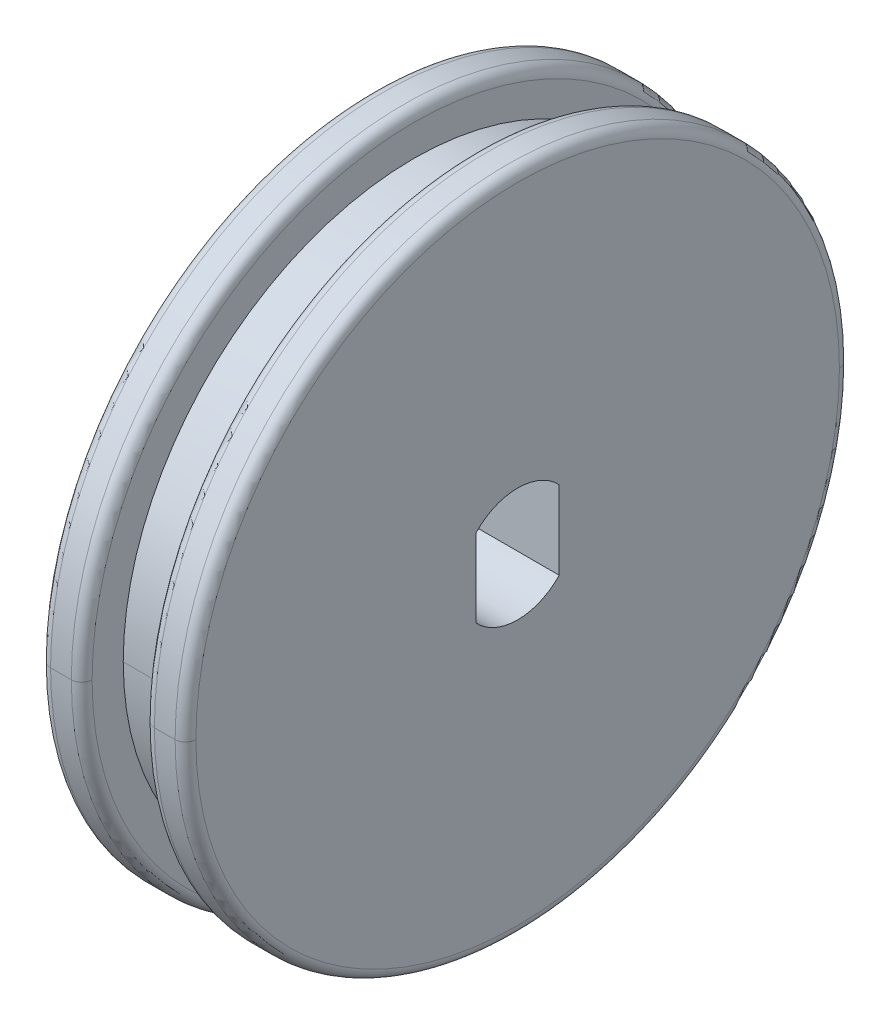
ISO-10303-21;
HEADER;
FILE_DESCRIPTION(('STEP AP214'),'2;1');
FILE_NAME('part.step','',(''),(''),'','','');
FILE_SCHEMA(('AUTOMOTIVE_DESIGN { 1 0 10303 214 1 1 1 1 }'));
ENDSEC;
DATA;
#1=APPLICATION_CONTEXT('core data for automotive mechanical design processes');
#2=APPLICATION_PROTOCOL_DEFINITION('international standard','automotive_design',2000,#1);
#3=PRODUCT_CONTEXT('',#1,'mechanical');
#4=PRODUCT('Part','Part','',(#3));
#5=PRODUCT_RELATED_PRODUCT_CATEGORY('part','',(#4));
#6=PRODUCT_DEFINITION_FORMATION('','',#4);
#7=PRODUCT_DEFINITION_CONTEXT('part definition',#1,'design');
#8=PRODUCT_DEFINITION('design','',#6,#7);
#9=PRODUCT_DEFINITION_SHAPE('','',#8);
#10=(LENGTH_UNIT() NAMED_UNIT(*) SI_UNIT(.MILLI.,.METRE.));
#11=(NAMED_UNIT(*) PLANE_ANGLE_UNIT() SI_UNIT($,.RADIAN.));
#12=(NAMED_UNIT(*) SI_UNIT($,.STERADIAN.) SOLID_ANGLE_UNIT());
#13=UNCERTAINTY_MEASURE_WITH_UNIT(LENGTH_MEASURE(1.E-05),#10,'distance_accuracy_value','');
#14=(GEOMETRIC_REPRESENTATION_CONTEXT(3) GLOBAL_UNCERTAINTY_ASSIGNED_CONTEXT((#13)) GLOBAL_UNIT_ASSIGNED_CONTEXT((#10,
#11,#12)) REPRESENTATION_CONTEXT('',''));
#15=CARTESIAN_POINT('',(0.,0.,0.));
#16=DIRECTION('',(0.,0.,1.));
#17=DIRECTION('',(1.,0.,0.));
#18=AXIS2_PLACEMENT_3D('',#15,#16,#17);
#19=CARTESIAN_POINT('',(6.5,0.,0.));
#20=DIRECTION('',(-1.,0.,0.));
#21=DIRECTION('',(0.,0.,1.));
#22=AXIS2_PLACEMENT_3D('',#19,#20,#21);
#23=CYLINDRICAL_SURFACE('',#22,2.75);
#24=DIRECTION('',(-1.,0.,0.));
#25=VECTOR('',#24,1.);
#26=CARTESIAN_POINT('',(6.5,1.88745860881769,2.));
#27=LINE('',#26,#25);
#28=CARTESIAN_POINT('',(3.5,1.88745860881769,2.));
#29=VERTEX_POINT('',#28);
#30=CARTESIAN_POINT('',(-3.5,1.88745860881769,2.));
#31=VERTEX_POINT('',#30);
#32=EDGE_CURVE('E243',#29,#31,#27,.T.);
#33=ORIENTED_EDGE('',*,*,#32,.T.);
#34=CARTESIAN_POINT('',(-3.5,0.,0.));
#35=DIRECTION('',(-1.,0.,0.));
#36=DIRECTION('',(0.,0.,1.));
#37=AXIS2_PLACEMENT_3D('',#34,#35,#36);
#38=CIRCLE('',#37,2.75);
#39=CARTESIAN_POINT('',(-3.5,1.88745860881769,-2.));
#40=VERTEX_POINT('',#39);
#41=EDGE_CURVE('E280',#31,#40,#38,.T.);
#42=ORIENTED_EDGE('',*,*,#41,.T.);
#43=DIRECTION('',(-1.,0.,0.));
#44=VECTOR('',#43,1.);
#45=CARTESIAN_POINT('',(6.5,1.88745860881769,-2.));
#46=LINE('',#45,#44);
#47=CARTESIAN_POINT('',(3.5,1.88745860881769,-2.));
#48=VERTEX_POINT('',#47);
#49=EDGE_CURVE('E10',#48,#40,#46,.T.);
#50=ORIENTED_EDGE('',*,*,#49,.F.);
#51=CARTESIAN_POINT('',(3.5,0.,0.));
#52=DIRECTION('',(-1.,0.,0.));
#53=DIRECTION('',(0.,0.,1.));
#54=AXIS2_PLACEMENT_3D('',#51,#52,#53);
#55=CIRCLE('',#54,2.75);
#56=EDGE_CURVE('E226',#29,#48,#55,.T.);
#57=ORIENTED_EDGE('',*,*,#56,.F.);
#58=EDGE_LOOP('',(#33,#42,#50,#57));
#59=FACE_BOUND('',#58,.T.);
#60=ADVANCED_FACE('F16',(#59),#23,.F.);
#61=CARTESIAN_POINT('',(6.5,0.,-2.));
#62=DIRECTION('',(0.,0.,1.));
#63=DIRECTION('',(0.,-1.,0.));
#64=AXIS2_PLACEMENT_3D('',#61,#62,#63);
#65=PLANE('',#64);
#66=DIRECTION('',(0.,1.,0.));
#67=VECTOR('',#66,1.);
#68=CARTESIAN_POINT('',(3.5,16.,-2.));
#69=LINE('',#68,#67);
#70=CARTESIAN_POINT('',(3.5,-1.88745860881769,-2.));
#71=VERTEX_POINT('',#70);
#72=EDGE_CURVE('E309',#71,#48,#69,.T.);
#73=ORIENTED_EDGE('',*,*,#72,.T.);
#74=ORIENTED_EDGE('',*,*,#49,.T.);
#75=DIRECTION('',(0.,1.,0.));
#76=VECTOR('',#75,1.);
#77=CARTESIAN_POINT('',(-3.5,0.,-2.));
#78=LINE('',#77,#76);
#79=CARTESIAN_POINT('',(-3.5,-1.88745860881769,-2.));
#80=VERTEX_POINT('',#79);
#81=EDGE_CURVE('E244',#80,#40,#78,.T.);
#82=ORIENTED_EDGE('',*,*,#81,.F.);
#83=DIRECTION('',(-1.,0.,0.));
#84=VECTOR('',#83,1.);
#85=CARTESIAN_POINT('',(6.5,-1.88745860881769,-2.));
#86=LINE('',#85,#84);
#87=EDGE_CURVE('E27',#71,#80,#86,.T.);
#88=ORIENTED_EDGE('',*,*,#87,.F.);
#89=EDGE_LOOP('',(#73,#74,#82,#88));
#90=FACE_BOUND('',#89,.T.);
#91=ADVANCED_FACE('F368',(#90),#65,.T.);
#92=CARTESIAN_POINT('',(6.5,0.,0.));
#93=DIRECTION('',(-1.,0.,0.));
#94=DIRECTION('',(0.,0.,1.));
#95=AXIS2_PLACEMENT_3D('',#92,#93,#94);
#96=CYLINDRICAL_SURFACE('',#95,2.75);
#97=ORIENTED_EDGE('',*,*,#87,.T.);
#98=CARTESIAN_POINT('',(-3.5,0.,0.));
#99=DIRECTION('',(-1.,0.,0.));
#100=DIRECTION('',(0.,0.,1.));
#101=AXIS2_PLACEMENT_3D('',#98,#99,#100);
#102=CIRCLE('',#101,2.75);
#103=CARTESIAN_POINT('',(-3.5,-1.88745860881769,2.));
#104=VERTEX_POINT('',#103);
#105=EDGE_CURVE('E245',#80,#104,#102,.T.);
#106=ORIENTED_EDGE('',*,*,#105,.T.);
#107=DIRECTION('',(-1.,0.,0.));
#108=VECTOR('',#107,1.);
#109=CARTESIAN_POINT('',(6.5,-1.88745860881769,2.));
#110=LINE('',#109,#108);
#111=CARTESIAN_POINT('',(3.5,-1.88745860881769,2.));
#112=VERTEX_POINT('',#111);
#113=EDGE_CURVE('E110',#112,#104,#110,.T.);
#114=ORIENTED_EDGE('',*,*,#113,.F.);
#115=CARTESIAN_POINT('',(3.5,0.,0.));
#116=DIRECTION('',(-1.,0.,0.));
#117=DIRECTION('',(0.,0.,1.));
#118=AXIS2_PLACEMENT_3D('',#115,#116,#117);
#119=CIRCLE('',#118,2.75);
#120=EDGE_CURVE('E20',#71,#112,#119,.T.);
#121=ORIENTED_EDGE('',*,*,#120,.F.);
#122=EDGE_LOOP('',(#97,#106,#114,#121));
#123=FACE_BOUND('',#122,.T.);
#124=ADVANCED_FACE('F378',(#123),#96,.F.);
#125=CARTESIAN_POINT('',(6.5,0.,2.));
#126=DIRECTION('',(0.,0.,1.));
#127=DIRECTION('',(0.,-1.,0.));
#128=AXIS2_PLACEMENT_3D('',#125,#126,#127);
#129=PLANE('',#128);
#130=ORIENTED_EDGE('',*,*,#113,.T.);
#131=DIRECTION('',(0.,1.,0.));
#132=VECTOR('',#131,1.);
#133=CARTESIAN_POINT('',(-3.5,0.,2.));
#134=LINE('',#133,#132);
#135=EDGE_CURVE('E248',#104,#31,#134,.T.);
#136=ORIENTED_EDGE('',*,*,#135,.T.);
#137=ORIENTED_EDGE('',*,*,#32,.F.);
#138=DIRECTION('',(0.,1.,0.));
#139=VECTOR('',#138,1.);
#140=CARTESIAN_POINT('',(3.5,16.,2.));
#141=LINE('',#140,#139);
#142=EDGE_CURVE('E222',#112,#29,#141,.T.);
#143=ORIENTED_EDGE('',*,*,#142,.F.);
#144=EDGE_LOOP('',(#130,#136,#137,#143));
#145=FACE_BOUND('',#144,.T.);
#146=ADVANCED_FACE('F372',(#145),#129,.F.);
#147=CARTESIAN_POINT('',(3.,0.,0.));
#148=DIRECTION('',(-1.,0.,0.));
#149=DIRECTION('',(0.,0.,1.));
#150=AXIS2_PLACEMENT_3D('',#147,#148,#149);
#151=TOROIDAL_SURFACE('',#150,15.5,0.5);
#152=CARTESIAN_POINT('',(3.,0.,-15.5));
#153=DIRECTION('',(0.,1.,0.));
#154=DIRECTION('',(0.,0.,1.));
#155=AXIS2_PLACEMENT_3D('',#152,#153,#154);
#156=CIRCLE('',#155,0.5);
#157=CARTESIAN_POINT('',(3.5,0.,-15.5));
#158=VERTEX_POINT('',#157);
#159=CARTESIAN_POINT('',(3.,0.,-16.));
#160=VERTEX_POINT('',#159);
#161=EDGE_CURVE('E151',#158,#160,#156,.T.);
#162=ORIENTED_EDGE('',*,*,#161,.F.);
#163=CARTESIAN_POINT('',(3.5,0.,0.));
#164=DIRECTION('',(1.,0.,0.));
#165=DIRECTION('',(0.,0.,1.));
#166=AXIS2_PLACEMENT_3D('',#163,#164,#165);
#167=CIRCLE('',#166,15.5);
#168=CARTESIAN_POINT('',(3.5,0.,15.5));
#169=VERTEX_POINT('',#168);
#170=EDGE_CURVE('E146',#169,#158,#167,.T.);
#171=ORIENTED_EDGE('',*,*,#170,.F.);
#172=CARTESIAN_POINT('',(3.,0.,15.5));
#173=DIRECTION('',(0.,-1.,0.));
#174=DIRECTION('',(0.,0.,-1.));
#175=AXIS2_PLACEMENT_3D('',#172,#173,#174);
#176=CIRCLE('',#175,0.5);
#177=CARTESIAN_POINT('',(3.,0.,16.));
#178=VERTEX_POINT('',#177);
#179=EDGE_CURVE('E148',#169,#178,#176,.T.);
#180=ORIENTED_EDGE('',*,*,#179,.T.);
#181=CARTESIAN_POINT('',(3.,0.,0.));
#182=DIRECTION('',(-1.,0.,0.));
#183=DIRECTION('',(0.,0.,1.));
#184=AXIS2_PLACEMENT_3D('',#181,#182,#183);
#185=CIRCLE('',#184,16.);
#186=EDGE_CURVE('E258',#160,#178,#185,.T.);
#187=ORIENTED_EDGE('',*,*,#186,.F.);
#188=EDGE_LOOP('',(#162,#171,#180,#187));
#189=FACE_BOUND('',#188,.T.);
#190=ADVANCED_FACE('F18',(#189),#151,.T.);
#191=CARTESIAN_POINT('',(2.,0.,0.));
#192=DIRECTION('',(1.,0.,0.));
#193=DIRECTION('',(0.,0.,-1.));
#194=AXIS2_PLACEMENT_3D('',#191,#192,#193);
#195=TOROIDAL_SURFACE('',#194,15.5,0.5);
#196=CARTESIAN_POINT('',(2.,0.,15.5));
#197=DIRECTION('',(0.,1.,0.));
#198=DIRECTION('',(0.,0.,1.));
#199=AXIS2_PLACEMENT_3D('',#196,#197,#198);
#200=CIRCLE('',#199,0.5);
#201=CARTESIAN_POINT('',(1.5,0.,15.5));
#202=VERTEX_POINT('',#201);
#203=CARTESIAN_POINT('',(2.,0.,16.));
#204=VERTEX_POINT('',#203);
#205=EDGE_CURVE('E220',#202,#204,#200,.T.);
#206=ORIENTED_EDGE('',*,*,#205,.F.);
#207=CARTESIAN_POINT('',(1.5,0.,0.));
#208=DIRECTION('',(-1.,0.,0.));
#209=DIRECTION('',(0.,0.,-1.));
#210=AXIS2_PLACEMENT_3D('',#207,#208,#209);
#211=CIRCLE('',#210,15.5);
#212=CARTESIAN_POINT('',(1.5,0.,-15.5));
#213=VERTEX_POINT('',#212);
#214=EDGE_CURVE('E274',#213,#202,#211,.T.);
#215=ORIENTED_EDGE('',*,*,#214,.F.);
#216=CARTESIAN_POINT('',(2.,0.,-15.5));
#217=DIRECTION('',(0.,-1.,0.));
#218=DIRECTION('',(0.,0.,-1.));
#219=AXIS2_PLACEMENT_3D('',#216,#217,#218);
#220=CIRCLE('',#219,0.5);
#221=CARTESIAN_POINT('',(2.,0.,-16.));
#222=VERTEX_POINT('',#221);
#223=EDGE_CURVE('E200',#213,#222,#220,.T.);
#224=ORIENTED_EDGE('',*,*,#223,.T.);
#225=CARTESIAN_POINT('',(2.,0.,0.));
#226=DIRECTION('',(1.,0.,0.));
#227=DIRECTION('',(0.,0.,-1.));
#228=AXIS2_PLACEMENT_3D('',#225,#226,#227);
#229=CIRCLE('',#228,16.);
#230=EDGE_CURVE('E156',#204,#222,#229,.T.);
#231=ORIENTED_EDGE('',*,*,#230,.F.);
#232=EDGE_LOOP('',(#206,#215,#224,#231));
#233=FACE_BOUND('',#232,.T.);
#234=ADVANCED_FACE('F396',(#233),#195,.T.);
#235=CARTESIAN_POINT('',(-2.,0.,0.));
#236=DIRECTION('',(-1.,0.,0.));
#237=DIRECTION('',(0.,0.,1.));
#238=AXIS2_PLACEMENT_3D('',#235,#236,#237);
#239=TOROIDAL_SURFACE('',#238,15.5,0.5);
#240=CARTESIAN_POINT('',(-2.,0.,-15.5));
#241=DIRECTION('',(0.,1.,0.));
#242=DIRECTION('',(0.,0.,1.));
#243=AXIS2_PLACEMENT_3D('',#240,#241,#242);
#244=CIRCLE('',#243,0.5);
#245=CARTESIAN_POINT('',(-1.5,0.,-15.5));
#246=VERTEX_POINT('',#245);
#247=CARTESIAN_POINT('',(-2.,0.,-16.));
#248=VERTEX_POINT('',#247);
#249=EDGE_CURVE('E188',#246,#248,#244,.T.);
#250=ORIENTED_EDGE('',*,*,#249,.F.);
#251=CARTESIAN_POINT('',(-1.5,0.,0.));
#252=DIRECTION('',(1.,0.,0.));
#253=DIRECTION('',(0.,0.,1.));
#254=AXIS2_PLACEMENT_3D('',#251,#252,#253);
#255=CIRCLE('',#254,15.5);
#256=CARTESIAN_POINT('',(-1.5,0.,15.5));
#257=VERTEX_POINT('',#256);
#258=EDGE_CURVE('E180',#257,#246,#255,.T.);
#259=ORIENTED_EDGE('',*,*,#258,.F.);
#260=CARTESIAN_POINT('',(-2.,0.,15.5));
#261=DIRECTION('',(0.,-1.,0.));
#262=DIRECTION('',(0.,0.,-1.));
#263=AXIS2_PLACEMENT_3D('',#260,#261,#262);
#264=CIRCLE('',#263,0.5);
#265=CARTESIAN_POINT('',(-2.,0.,16.));
#266=VERTEX_POINT('',#265);
#267=EDGE_CURVE('E271',#257,#266,#264,.T.);
#268=ORIENTED_EDGE('',*,*,#267,.T.);
#269=CARTESIAN_POINT('',(-2.,0.,0.));
#270=DIRECTION('',(-1.,0.,0.));
#271=DIRECTION('',(0.,0.,1.));
#272=AXIS2_PLACEMENT_3D('',#269,#270,#271);
#273=CIRCLE('',#272,16.);
#274=EDGE_CURVE('E181',#248,#266,#273,.T.);
#275=ORIENTED_EDGE('',*,*,#274,.F.);
#276=EDGE_LOOP('',(#250,#259,#268,#275));
#277=FACE_BOUND('',#276,.T.);
#278=ADVANCED_FACE('F350',(#277),#239,.T.);
#279=CARTESIAN_POINT('',(-3.,0.,0.));
#280=DIRECTION('',(1.,0.,0.));
#281=DIRECTION('',(0.,0.,-1.));
#282=AXIS2_PLACEMENT_3D('',#279,#280,#281);
#283=TOROIDAL_SURFACE('',#282,15.5,0.5);
#284=CARTESIAN_POINT('',(-3.,0.,15.5));
#285=DIRECTION('',(0.,1.,0.));
#286=DIRECTION('',(0.,0.,1.));
#287=AXIS2_PLACEMENT_3D('',#284,#285,#286);
#288=CIRCLE('',#287,0.5);
#289=CARTESIAN_POINT('',(-3.5,0.,15.5));
#290=VERTEX_POINT('',#289);
#291=CARTESIAN_POINT('',(-3.,0.,16.));
#292=VERTEX_POINT('',#291);
#293=EDGE_CURVE('E187',#290,#292,#288,.T.);
#294=ORIENTED_EDGE('',*,*,#293,.F.);
#295=CARTESIAN_POINT('',(-3.5,0.,0.));
#296=DIRECTION('',(-1.,0.,0.));
#297=DIRECTION('',(0.,0.,-1.));
#298=AXIS2_PLACEMENT_3D('',#295,#296,#297);
#299=CIRCLE('',#298,15.5);
#300=CARTESIAN_POINT('',(-3.5,0.,-15.5));
#301=VERTEX_POINT('',#300);
#302=EDGE_CURVE('E175',#301,#290,#299,.T.);
#303=ORIENTED_EDGE('',*,*,#302,.F.);
#304=CARTESIAN_POINT('',(-3.,0.,-15.5));
#305=DIRECTION('',(0.,-1.,0.));
#306=DIRECTION('',(0.,0.,-1.));
#307=AXIS2_PLACEMENT_3D('',#304,#305,#306);
#308=CIRCLE('',#307,0.5);
#309=CARTESIAN_POINT('',(-3.,0.,-16.));
#310=VERTEX_POINT('',#309);
#311=EDGE_CURVE('E186',#301,#310,#308,.T.);
#312=ORIENTED_EDGE('',*,*,#311,.T.);
#313=CARTESIAN_POINT('',(-3.,0.,0.));
#314=DIRECTION('',(1.,0.,0.));
#315=DIRECTION('',(0.,0.,-1.));
#316=AXIS2_PLACEMENT_3D('',#313,#314,#315);
#317=CIRCLE('',#316,16.);
#318=EDGE_CURVE('E177',#292,#310,#317,.T.);
#319=ORIENTED_EDGE('',*,*,#318,.F.);
#320=EDGE_LOOP('',(#294,#303,#312,#319));
#321=FACE_BOUND('',#320,.T.);
#322=ADVANCED_FACE('F335',(#321),#283,.T.);
#323=CARTESIAN_POINT('',(-3.5,0.,0.));
#324=DIRECTION('',(1.,0.,0.));
#325=DIRECTION('',(0.,1.,0.));
#326=AXIS2_PLACEMENT_3D('',#323,#324,#325);
#327=PLANE('',#326);
#328=ORIENTED_EDGE('',*,*,#41,.F.);
#329=ORIENTED_EDGE('',*,*,#135,.F.);
#330=ORIENTED_EDGE('',*,*,#105,.F.);
#331=ORIENTED_EDGE('',*,*,#81,.T.);
#332=EDGE_LOOP('',(#328,#329,#330,#331));
#333=FACE_BOUND('',#332,.T.);
#334=ORIENTED_EDGE('',*,*,#302,.T.);
#335=CARTESIAN_POINT('',(-3.5,0.,0.));
#336=DIRECTION('',(-1.,0.,0.));
#337=DIRECTION('',(0.,0.,-1.));
#338=AXIS2_PLACEMENT_3D('',#335,#336,#337);
#339=CIRCLE('',#338,15.5);
#340=EDGE_CURVE('E316',#290,#301,#339,.T.);
#341=ORIENTED_EDGE('',*,*,#340,.T.);
#342=EDGE_LOOP('',(#334,#341));
#343=FACE_BOUND('',#342,.T.);
#344=ADVANCED_FACE('F376',(#333,#343),#327,.F.);
#345=CARTESIAN_POINT('',(3.5,16.,0.));
#346=DIRECTION('',(-1.,0.,0.));
#347=DIRECTION('',(0.,0.,1.));
#348=AXIS2_PLACEMENT_3D('',#345,#346,#347);
#349=PLANE('',#348);
#350=ORIENTED_EDGE('',*,*,#120,.T.);
#351=ORIENTED_EDGE('',*,*,#142,.T.);
#352=ORIENTED_EDGE('',*,*,#56,.T.);
#353=ORIENTED_EDGE('',*,*,#72,.F.);
#354=EDGE_LOOP('',(#350,#351,#352,#353));
#355=FACE_BOUND('',#354,.T.);
#356=ORIENTED_EDGE('',*,*,#170,.T.);
#357=CARTESIAN_POINT('',(3.5,0.,0.));
#358=DIRECTION('',(1.,0.,0.));
#359=DIRECTION('',(0.,0.,1.));
#360=AXIS2_PLACEMENT_3D('',#357,#358,#359);
#361=CIRCLE('',#360,15.5);
#362=EDGE_CURVE('E160',#158,#169,#361,.T.);
#363=ORIENTED_EDGE('',*,*,#362,.T.);
#364=EDGE_LOOP('',(#356,#363));
#365=FACE_BOUND('',#364,.T.);
#366=ADVANCED_FACE('F166',(#355,#365),#349,.F.);
#367=CARTESIAN_POINT('',(-3.5,0.,0.));
#368=DIRECTION('',(-1.,0.,0.));
#369=DIRECTION('',(0.,0.,1.));
#370=AXIS2_PLACEMENT_3D('',#367,#368,#369);
#371=CYLINDRICAL_SURFACE('',#370,16.);
#372=DIRECTION('',(-1.,0.,0.));
#373=VECTOR('',#372,1.);
#374=CARTESIAN_POINT('',(-3.5,0.,-16.));
#375=LINE('',#374,#373);
#376=EDGE_CURVE('E199',#160,#222,#375,.T.);
#377=ORIENTED_EDGE('',*,*,#376,.F.);
#378=ORIENTED_EDGE('',*,*,#186,.T.);
#379=DIRECTION('',(-1.,0.,0.));
#380=VECTOR('',#379,1.);
#381=CARTESIAN_POINT('',(-3.5,0.,16.));
#382=LINE('',#381,#380);
#383=EDGE_CURVE('E194',#178,#204,#382,.T.);
#384=ORIENTED_EDGE('',*,*,#383,.T.);
#385=ORIENTED_EDGE('',*,*,#230,.T.);
#386=EDGE_LOOP('',(#377,#378,#384,#385));
#387=FACE_BOUND('',#386,.T.);
#388=ADVANCED_FACE('F403',(#387),#371,.T.);
#389=CARTESIAN_POINT('',(1.5,14.,0.));
#390=DIRECTION('',(1.,0.,0.));
#391=DIRECTION('',(0.,1.,0.));
#392=AXIS2_PLACEMENT_3D('',#389,#390,#391);
#393=PLANE('',#392);
#394=CARTESIAN_POINT('',(1.5,0.,0.));
#395=DIRECTION('',(-1.,0.,0.));
#396=DIRECTION('',(0.,0.,1.));
#397=AXIS2_PLACEMENT_3D('',#394,#395,#396);
#398=CIRCLE('',#397,14.);
#399=CARTESIAN_POINT('',(1.5,0.,14.));
#400=VERTEX_POINT('',#399);
#401=CARTESIAN_POINT('',(1.5,0.,-14.));
#402=VERTEX_POINT('',#401);
#403=EDGE_CURVE('E198',#400,#402,#398,.T.);
#404=ORIENTED_EDGE('',*,*,#403,.F.);
#405=CARTESIAN_POINT('',(1.5,0.,0.));
#406=DIRECTION('',(-1.,0.,0.));
#407=DIRECTION('',(0.,0.,1.));
#408=AXIS2_PLACEMENT_3D('',#405,#406,#407);
#409=CIRCLE('',#408,14.);
#410=EDGE_CURVE('E267',#402,#400,#409,.T.);
#411=ORIENTED_EDGE('',*,*,#410,.F.);
#412=EDGE_LOOP('',(#404,#411));
#413=FACE_BOUND('',#412,.T.);
#414=ORIENTED_EDGE('',*,*,#214,.T.);
#415=CARTESIAN_POINT('',(1.5,0.,0.));
#416=DIRECTION('',(-1.,0.,0.));
#417=DIRECTION('',(0.,0.,-1.));
#418=AXIS2_PLACEMENT_3D('',#415,#416,#417);
#419=CIRCLE('',#418,15.5);
#420=EDGE_CURVE('E164',#202,#213,#419,.T.);
#421=ORIENTED_EDGE('',*,*,#420,.T.);
#422=EDGE_LOOP('',(#414,#421));
#423=FACE_BOUND('',#422,.T.);
#424=ADVANCED_FACE('F296',(#413,#423),#393,.F.);
#425=CARTESIAN_POINT('',(-3.5,0.,0.));
#426=DIRECTION('',(-1.,0.,0.));
#427=DIRECTION('',(0.,0.,1.));
#428=AXIS2_PLACEMENT_3D('',#425,#426,#427);
#429=CYLINDRICAL_SURFACE('',#428,14.);
#430=DIRECTION('',(-1.,0.,0.));
#431=VECTOR('',#430,1.);
#432=CARTESIAN_POINT('',(-3.5,0.,-14.));
#433=LINE('',#432,#431);
#434=CARTESIAN_POINT('',(-1.5,0.,-14.));
#435=VERTEX_POINT('',#434);
#436=EDGE_CURVE('E205',#402,#435,#433,.T.);
#437=ORIENTED_EDGE('',*,*,#436,.F.);
#438=ORIENTED_EDGE('',*,*,#410,.T.);
#439=DIRECTION('',(-1.,0.,0.));
#440=VECTOR('',#439,1.);
#441=CARTESIAN_POINT('',(-3.5,0.,14.));
#442=LINE('',#441,#440);
#443=CARTESIAN_POINT('',(-1.5,0.,14.));
#444=VERTEX_POINT('',#443);
#445=EDGE_CURVE('E210',#400,#444,#442,.T.);
#446=ORIENTED_EDGE('',*,*,#445,.T.);
#447=CARTESIAN_POINT('',(-1.5,0.,0.));
#448=DIRECTION('',(-1.,0.,0.));
#449=DIRECTION('',(0.,0.,1.));
#450=AXIS2_PLACEMENT_3D('',#447,#448,#449);
#451=CIRCLE('',#450,14.);
#452=EDGE_CURVE('E255',#435,#444,#451,.T.);
#453=ORIENTED_EDGE('',*,*,#452,.F.);
#454=EDGE_LOOP('',(#437,#438,#446,#453));
#455=FACE_BOUND('',#454,.T.);
#456=ADVANCED_FACE('F289',(#455),#429,.T.);
#457=CARTESIAN_POINT('',(-1.5,16.,0.));
#458=DIRECTION('',(-1.,0.,0.));
#459=DIRECTION('',(0.,0.,1.));
#460=AXIS2_PLACEMENT_3D('',#457,#458,#459);
#461=PLANE('',#460);
#462=CARTESIAN_POINT('',(-1.5,0.,0.));
#463=DIRECTION('',(-1.,0.,0.));
#464=DIRECTION('',(0.,0.,1.));
#465=AXIS2_PLACEMENT_3D('',#462,#463,#464);
#466=CIRCLE('',#465,14.);
#467=EDGE_CURVE('E209',#444,#435,#466,.T.);
#468=ORIENTED_EDGE('',*,*,#467,.T.);
#469=ORIENTED_EDGE('',*,*,#452,.T.);
#470=EDGE_LOOP('',(#468,#469));
#471=FACE_BOUND('',#470,.T.);
#472=ORIENTED_EDGE('',*,*,#258,.T.);
#473=CARTESIAN_POINT('',(-1.5,0.,0.));
#474=DIRECTION('',(1.,0.,0.));
#475=DIRECTION('',(0.,0.,1.));
#476=AXIS2_PLACEMENT_3D('',#473,#474,#475);
#477=CIRCLE('',#476,15.5);
#478=EDGE_CURVE('E193',#246,#257,#477,.T.);
#479=ORIENTED_EDGE('',*,*,#478,.T.);
#480=EDGE_LOOP('',(#472,#479));
#481=FACE_BOUND('',#480,.T.);
#482=ADVANCED_FACE('F406',(#471,#481),#461,.F.);
#483=CARTESIAN_POINT('',(-3.5,0.,0.));
#484=DIRECTION('',(-1.,0.,0.));
#485=DIRECTION('',(0.,0.,1.));
#486=AXIS2_PLACEMENT_3D('',#483,#484,#485);
#487=CYLINDRICAL_SURFACE('',#486,16.);
#488=DIRECTION('',(-1.,0.,0.));
#489=VECTOR('',#488,1.);
#490=CARTESIAN_POINT('',(-3.5,0.,-16.));
#491=LINE('',#490,#489);
#492=EDGE_CURVE('E214',#248,#310,#491,.T.);
#493=ORIENTED_EDGE('',*,*,#492,.F.);
#494=ORIENTED_EDGE('',*,*,#274,.T.);
#495=DIRECTION('',(-1.,0.,0.));
#496=VECTOR('',#495,1.);
#497=CARTESIAN_POINT('',(-3.5,0.,16.));
#498=LINE('',#497,#496);
#499=EDGE_CURVE('E217',#266,#292,#498,.T.);
#500=ORIENTED_EDGE('',*,*,#499,.T.);
#501=ORIENTED_EDGE('',*,*,#318,.T.);
#502=EDGE_LOOP('',(#493,#494,#500,#501));
#503=FACE_BOUND('',#502,.T.);
#504=ADVANCED_FACE('F339',(#503),#487,.T.);
#505=CARTESIAN_POINT('',(-3.5,0.,0.));
#506=DIRECTION('',(-1.,0.,0.));
#507=DIRECTION('',(0.,0.,1.));
#508=AXIS2_PLACEMENT_3D('',#505,#506,#507);
#509=CYLINDRICAL_SURFACE('',#508,16.);
#510=CARTESIAN_POINT('',(-2.,0.,0.));
#511=DIRECTION('',(-1.,0.,0.));
#512=DIRECTION('',(0.,0.,1.));
#513=AXIS2_PLACEMENT_3D('',#510,#511,#512);
#514=CIRCLE('',#513,16.);
#515=EDGE_CURVE('E192',#266,#248,#514,.T.);
#516=ORIENTED_EDGE('',*,*,#515,.T.);
#517=ORIENTED_EDGE('',*,*,#492,.T.);
#518=CARTESIAN_POINT('',(-3.,0.,0.));
#519=DIRECTION('',(1.,0.,0.));
#520=DIRECTION('',(0.,0.,-1.));
#521=AXIS2_PLACEMENT_3D('',#518,#519,#520);
#522=CIRCLE('',#521,16.);
#523=EDGE_CURVE('E182',#310,#292,#522,.T.);
#524=ORIENTED_EDGE('',*,*,#523,.T.);
#525=ORIENTED_EDGE('',*,*,#499,.F.);
#526=EDGE_LOOP('',(#516,#517,#524,#525));
#527=FACE_BOUND('',#526,.T.);
#528=ADVANCED_FACE('F341',(#527),#509,.T.);
#529=CARTESIAN_POINT('',(-3.5,0.,0.));
#530=DIRECTION('',(-1.,0.,0.));
#531=DIRECTION('',(0.,0.,1.));
#532=AXIS2_PLACEMENT_3D('',#529,#530,#531);
#533=CYLINDRICAL_SURFACE('',#532,14.);
#534=ORIENTED_EDGE('',*,*,#403,.T.);
#535=ORIENTED_EDGE('',*,*,#436,.T.);
#536=ORIENTED_EDGE('',*,*,#467,.F.);
#537=ORIENTED_EDGE('',*,*,#445,.F.);
#538=EDGE_LOOP('',(#534,#535,#536,#537));
#539=FACE_BOUND('',#538,.T.);
#540=ADVANCED_FACE('F295',(#539),#533,.T.);
#541=CARTESIAN_POINT('',(-3.5,0.,0.));
#542=DIRECTION('',(-1.,0.,0.));
#543=DIRECTION('',(0.,0.,1.));
#544=AXIS2_PLACEMENT_3D('',#541,#542,#543);
#545=CYLINDRICAL_SURFACE('',#544,16.);
#546=CARTESIAN_POINT('',(3.,0.,0.));
#547=DIRECTION('',(-1.,0.,0.));
#548=DIRECTION('',(0.,0.,1.));
#549=AXIS2_PLACEMENT_3D('',#546,#547,#548);
#550=CIRCLE('',#549,16.);
#551=EDGE_CURVE('E162',#178,#160,#550,.T.);
#552=ORIENTED_EDGE('',*,*,#551,.T.);
#553=ORIENTED_EDGE('',*,*,#376,.T.);
#554=CARTESIAN_POINT('',(2.,0.,0.));
#555=DIRECTION('',(1.,0.,0.));
#556=DIRECTION('',(0.,0.,-1.));
#557=AXIS2_PLACEMENT_3D('',#554,#555,#556);
#558=CIRCLE('',#557,16.);
#559=EDGE_CURVE('E204',#222,#204,#558,.T.);
#560=ORIENTED_EDGE('',*,*,#559,.T.);
#561=ORIENTED_EDGE('',*,*,#383,.F.);
#562=EDGE_LOOP('',(#552,#553,#560,#561));
#563=FACE_BOUND('',#562,.T.);
#564=ADVANCED_FACE('F413',(#563),#545,.T.);
#565=CARTESIAN_POINT('',(-3.,0.,0.));
#566=DIRECTION('',(1.,0.,0.));
#567=DIRECTION('',(0.,0.,-1.));
#568=AXIS2_PLACEMENT_3D('',#565,#566,#567);
#569=TOROIDAL_SURFACE('',#568,15.5,0.5);
#570=ORIENTED_EDGE('',*,*,#340,.F.);
#571=ORIENTED_EDGE('',*,*,#293,.T.);
#572=ORIENTED_EDGE('',*,*,#523,.F.);
#573=ORIENTED_EDGE('',*,*,#311,.F.);
#574=EDGE_LOOP('',(#570,#571,#572,#573));
#575=FACE_BOUND('',#574,.T.);
#576=ADVANCED_FACE('F332',(#575),#569,.T.);
#577=CARTESIAN_POINT('',(-2.,0.,0.));
#578=DIRECTION('',(-1.,0.,0.));
#579=DIRECTION('',(0.,0.,1.));
#580=AXIS2_PLACEMENT_3D('',#577,#578,#579);
#581=TOROIDAL_SURFACE('',#580,15.5,0.5);
#582=ORIENTED_EDGE('',*,*,#478,.F.);
#583=ORIENTED_EDGE('',*,*,#249,.T.);
#584=ORIENTED_EDGE('',*,*,#515,.F.);
#585=ORIENTED_EDGE('',*,*,#267,.F.);
#586=EDGE_LOOP('',(#582,#583,#584,#585));
#587=FACE_BOUND('',#586,.T.);
#588=ADVANCED_FACE('F347',(#587),#581,.T.);
#589=CARTESIAN_POINT('',(2.,0.,0.));
#590=DIRECTION('',(1.,0.,0.));
#591=DIRECTION('',(0.,0.,-1.));
#592=AXIS2_PLACEMENT_3D('',#589,#590,#591);
#593=TOROIDAL_SURFACE('',#592,15.5,0.5);
#594=ORIENTED_EDGE('',*,*,#420,.F.);
#595=ORIENTED_EDGE('',*,*,#205,.T.);
#596=ORIENTED_EDGE('',*,*,#559,.F.);
#597=ORIENTED_EDGE('',*,*,#223,.F.);
#598=EDGE_LOOP('',(#594,#595,#596,#597));
#599=FACE_BOUND('',#598,.T.);
#600=ADVANCED_FACE('F397',(#599),#593,.T.);
#601=CARTESIAN_POINT('',(3.,0.,0.));
#602=DIRECTION('',(-1.,0.,0.));
#603=DIRECTION('',(0.,0.,1.));
#604=AXIS2_PLACEMENT_3D('',#601,#602,#603);
#605=TOROIDAL_SURFACE('',#604,15.5,0.5);
#606=ORIENTED_EDGE('',*,*,#362,.F.);
#607=ORIENTED_EDGE('',*,*,#161,.T.);
#608=ORIENTED_EDGE('',*,*,#551,.F.);
#609=ORIENTED_EDGE('',*,*,#179,.F.);
#610=EDGE_LOOP('',(#606,#607,#608,#609));
#611=FACE_BOUND('',#610,.T.);
#612=ADVANCED_FACE('F159',(#611),#605,.T.);
#613=CLOSED_SHELL('',(#60,#91,#124,#146,#190,#234,#278,#322,#344,#366,#388,#424,#456,#482,#504,
#528,#540,#564,#576,#588,#600,#612));
#614=MANIFOLD_SOLID_BREP('B1',#613);
#615=ADVANCED_BREP_SHAPE_REPRESENTATION('',(#18,#614),#14);
#616=SHAPE_DEFINITION_REPRESENTATION(#9,#615);
ENDSEC;
END-ISO-10303-21;
